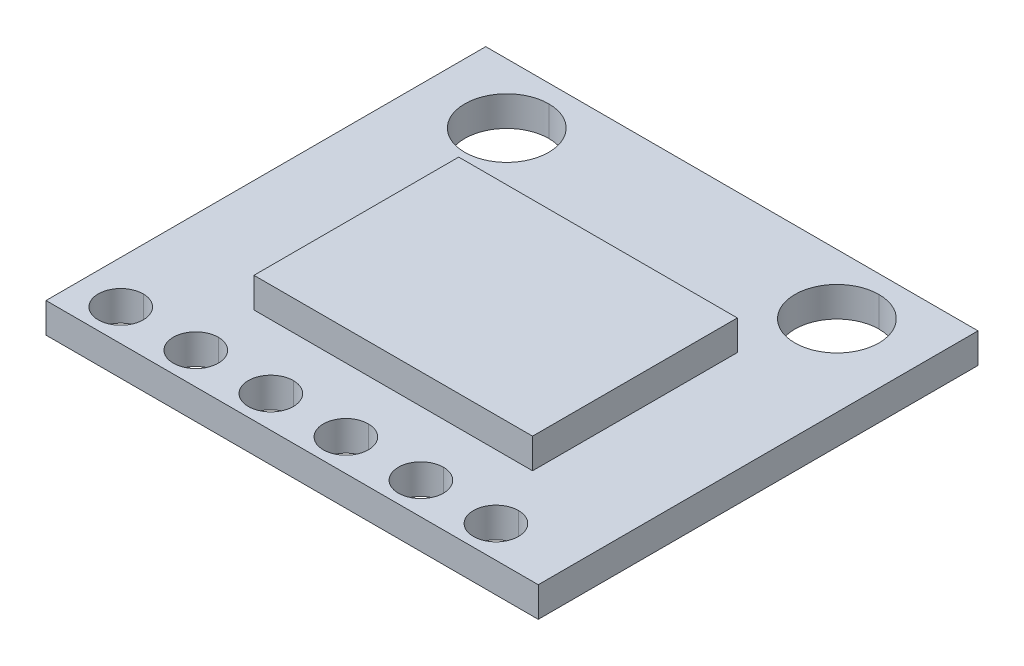
ISO-10303-21;
HEADER;
FILE_DESCRIPTION(('STEP AP214'),'2;1');
FILE_NAME('part.step','',(''),(''),'','','');
FILE_SCHEMA(('AUTOMOTIVE_DESIGN { 1 0 10303 214 1 1 1 1 }'));
ENDSEC;
DATA;
#1=APPLICATION_CONTEXT('core data for automotive mechanical design processes');
#2=APPLICATION_PROTOCOL_DEFINITION('international standard','automotive_design',2000,#1);
#3=PRODUCT_CONTEXT('',#1,'mechanical');
#4=PRODUCT('Part','Part','',(#3));
#5=PRODUCT_RELATED_PRODUCT_CATEGORY('part','',(#4));
#6=PRODUCT_DEFINITION_FORMATION('','',#4);
#7=PRODUCT_DEFINITION_CONTEXT('part definition',#1,'design');
#8=PRODUCT_DEFINITION('design','',#6,#7);
#9=PRODUCT_DEFINITION_SHAPE('','',#8);
#10=(LENGTH_UNIT() NAMED_UNIT(*) SI_UNIT(.MILLI.,.METRE.));
#11=(NAMED_UNIT(*) PLANE_ANGLE_UNIT() SI_UNIT($,.RADIAN.));
#12=(NAMED_UNIT(*) SI_UNIT($,.STERADIAN.) SOLID_ANGLE_UNIT());
#13=UNCERTAINTY_MEASURE_WITH_UNIT(LENGTH_MEASURE(1.E-05),#10,'distance_accuracy_value','');
#14=(GEOMETRIC_REPRESENTATION_CONTEXT(3) GLOBAL_UNCERTAINTY_ASSIGNED_CONTEXT((#13)) GLOBAL_UNIT_ASSIGNED_CONTEXT((#10,
#11,#12)) REPRESENTATION_CONTEXT('',''));
#15=CARTESIAN_POINT('',(0.,0.,0.));
#16=DIRECTION('',(0.,0.,1.));
#17=DIRECTION('',(1.,0.,0.));
#18=AXIS2_PLACEMENT_3D('',#15,#16,#17);
#19=CARTESIAN_POINT('',(0.,2.,0.));
#20=DIRECTION('',(0.,1.,0.));
#21=DIRECTION('',(1.,0.,0.));
#22=AXIS2_PLACEMENT_3D('',#19,#20,#21);
#23=PLANE('',#22);
#24=DIRECTION('',(0.,0.,1.));
#25=VECTOR('',#24,1.);
#26=CARTESIAN_POINT('',(3.736721990265,2.,-10.0131106195));
#27=LINE('',#26,#25);
#28=CARTESIAN_POINT('',(3.736721990265,2.,-10.0131106195));
#29=VERTEX_POINT('',#28);
#30=CARTESIAN_POINT('',(3.736721990265,2.,-3.191395934166));
#31=VERTEX_POINT('',#30);
#32=EDGE_CURVE('E225',#29,#31,#27,.T.);
#33=ORIENTED_EDGE('',*,*,#32,.T.);
#34=DIRECTION('',(1.,0.,0.));
#35=VECTOR('',#34,1.);
#36=CARTESIAN_POINT('',(3.736721990265,2.,-3.191395934166));
#37=LINE('',#36,#35);
#38=CARTESIAN_POINT('',(13.018311487782,2.,-3.191395934166));
#39=VERTEX_POINT('',#38);
#40=EDGE_CURVE('E215',#31,#39,#37,.T.);
#41=ORIENTED_EDGE('',*,*,#40,.T.);
#42=DIRECTION('',(0.,0.,-1.));
#43=VECTOR('',#42,1.);
#44=CARTESIAN_POINT('',(13.018311487782,2.,-10.0131106195));
#45=LINE('',#44,#43);
#46=CARTESIAN_POINT('',(13.018311487782,2.,-10.0131106195));
#47=VERTEX_POINT('',#46);
#48=EDGE_CURVE('E25',#39,#47,#45,.T.);
#49=ORIENTED_EDGE('',*,*,#48,.T.);
#50=DIRECTION('',(-1.,0.,0.));
#51=VECTOR('',#50,1.);
#52=CARTESIAN_POINT('',(3.736721990265,2.,-10.0131106195));
#53=LINE('',#52,#51);
#54=EDGE_CURVE('E10',#47,#29,#53,.T.);
#55=ORIENTED_EDGE('',*,*,#54,.T.);
#56=EDGE_LOOP('',(#33,#41,#49,#55));
#57=FACE_BOUND('',#56,.T.);
#58=ADVANCED_FACE('F15',(#57),#23,.T.);
#59=CARTESIAN_POINT('',(3.736721990265,2.,-10.0131106195));
#60=DIRECTION('',(0.,0.,1.));
#61=DIRECTION('',(1.,0.,0.));
#62=AXIS2_PLACEMENT_3D('',#59,#60,#61);
#63=PLANE('',#62);
#64=DIRECTION('',(-1.,0.,0.));
#65=VECTOR('',#64,1.);
#66=CARTESIAN_POINT('',(3.736721990265,1.,-10.0131106195));
#67=LINE('',#66,#65);
#68=CARTESIAN_POINT('',(13.018311487782,1.,-10.0131106195));
#69=VERTEX_POINT('',#68);
#70=CARTESIAN_POINT('',(3.736721990265,1.,-10.0131106195));
#71=VERTEX_POINT('',#70);
#72=EDGE_CURVE('E325',#69,#71,#67,.T.);
#73=ORIENTED_EDGE('',*,*,#72,.T.);
#74=DIRECTION('',(0.,-1.,0.));
#75=VECTOR('',#74,1.);
#76=CARTESIAN_POINT('',(3.736721990265,2.,-10.0131106195));
#77=LINE('',#76,#75);
#78=EDGE_CURVE('E216',#29,#71,#77,.T.);
#79=ORIENTED_EDGE('',*,*,#78,.F.);
#80=ORIENTED_EDGE('',*,*,#54,.F.);
#81=DIRECTION('',(0.,-1.,0.));
#82=VECTOR('',#81,1.);
#83=CARTESIAN_POINT('',(13.018311487782,2.,-10.0131106195));
#84=LINE('',#83,#82);
#85=EDGE_CURVE('E222',#47,#69,#84,.T.);
#86=ORIENTED_EDGE('',*,*,#85,.T.);
#87=EDGE_LOOP('',(#73,#79,#80,#86));
#88=FACE_BOUND('',#87,.T.);
#89=ADVANCED_FACE('F526',(#88),#63,.F.);
#90=CARTESIAN_POINT('',(13.018311487782,2.,-10.0131106195));
#91=DIRECTION('',(-1.,0.,0.));
#92=DIRECTION('',(0.,0.,1.));
#93=AXIS2_PLACEMENT_3D('',#90,#91,#92);
#94=PLANE('',#93);
#95=DIRECTION('',(0.,0.,-1.));
#96=VECTOR('',#95,1.);
#97=CARTESIAN_POINT('',(13.018311487782,1.,-10.0131106195));
#98=LINE('',#97,#96);
#99=CARTESIAN_POINT('',(13.018311487782,1.,-3.191395934166));
#100=VERTEX_POINT('',#99);
#101=EDGE_CURVE('E197',#100,#69,#98,.T.);
#102=ORIENTED_EDGE('',*,*,#101,.T.);
#103=ORIENTED_EDGE('',*,*,#85,.F.);
#104=ORIENTED_EDGE('',*,*,#48,.F.);
#105=DIRECTION('',(0.,-1.,0.));
#106=VECTOR('',#105,1.);
#107=CARTESIAN_POINT('',(13.018311487782,2.,-3.191395934166));
#108=LINE('',#107,#106);
#109=EDGE_CURVE('E213',#39,#100,#108,.T.);
#110=ORIENTED_EDGE('',*,*,#109,.T.);
#111=EDGE_LOOP('',(#102,#103,#104,#110));
#112=FACE_BOUND('',#111,.T.);
#113=ADVANCED_FACE('F524',(#112),#94,.F.);
#114=CARTESIAN_POINT('',(3.736721990265,2.,-3.191395934166));
#115=DIRECTION('',(0.,0.,-1.));
#116=DIRECTION('',(0.,-1.,0.));
#117=AXIS2_PLACEMENT_3D('',#114,#115,#116);
#118=PLANE('',#117);
#119=DIRECTION('',(1.,0.,0.));
#120=VECTOR('',#119,1.);
#121=CARTESIAN_POINT('',(3.736721990265,1.,-3.191395934166));
#122=LINE('',#121,#120);
#123=CARTESIAN_POINT('',(3.736721990265,1.,-3.191395934166));
#124=VERTEX_POINT('',#123);
#125=EDGE_CURVE('E188',#124,#100,#122,.T.);
#126=ORIENTED_EDGE('',*,*,#125,.T.);
#127=ORIENTED_EDGE('',*,*,#109,.F.);
#128=ORIENTED_EDGE('',*,*,#40,.F.);
#129=DIRECTION('',(0.,-1.,0.));
#130=VECTOR('',#129,1.);
#131=CARTESIAN_POINT('',(3.736721990265,2.,-3.191395934166));
#132=LINE('',#131,#130);
#133=EDGE_CURVE('E234',#31,#124,#132,.T.);
#134=ORIENTED_EDGE('',*,*,#133,.T.);
#135=EDGE_LOOP('',(#126,#127,#128,#134));
#136=FACE_BOUND('',#135,.T.);
#137=ADVANCED_FACE('F513',(#136),#118,.F.);
#138=CARTESIAN_POINT('',(3.736721990265,2.,-10.0131106195));
#139=DIRECTION('',(1.,0.,0.));
#140=DIRECTION('',(0.,1.,0.));
#141=AXIS2_PLACEMENT_3D('',#138,#139,#140);
#142=PLANE('',#141);
#143=DIRECTION('',(0.,0.,1.));
#144=VECTOR('',#143,1.);
#145=CARTESIAN_POINT('',(3.736721990265,1.,-10.0131106195));
#146=LINE('',#145,#144);
#147=EDGE_CURVE('E282',#71,#124,#146,.T.);
#148=ORIENTED_EDGE('',*,*,#147,.T.);
#149=ORIENTED_EDGE('',*,*,#133,.F.);
#150=ORIENTED_EDGE('',*,*,#32,.F.);
#151=ORIENTED_EDGE('',*,*,#78,.T.);
#152=EDGE_LOOP('',(#148,#149,#150,#151));
#153=FACE_BOUND('',#152,.T.);
#154=ADVANCED_FACE('F517',(#153),#142,.F.);
#155=CARTESIAN_POINT('',(3.929004382958,0.,-1.061195065883));
#156=DIRECTION('',(0.,1.,0.));
#157=DIRECTION('',(0.,0.,1.));
#158=AXIS2_PLACEMENT_3D('',#155,#156,#157);
#159=CYLINDRICAL_SURFACE('',#158,0.75);
#160=DIRECTION('',(0.,1.,0.));
#161=VECTOR('',#160,1.);
#162=CARTESIAN_POINT('',(3.929004382958,0.,-1.811195065883));
#163=LINE('',#162,#161);
#164=CARTESIAN_POINT('',(3.929004382958,0.,-1.811195065883));
#165=VERTEX_POINT('',#164);
#166=CARTESIAN_POINT('',(3.929004382958,1.,-1.811195065883));
#167=VERTEX_POINT('',#166);
#168=EDGE_CURVE('E208',#165,#167,#163,.T.);
#169=ORIENTED_EDGE('',*,*,#168,.F.);
#170=CARTESIAN_POINT('',(3.929004382958,0.,-1.061195065883));
#171=DIRECTION('',(0.,1.,0.));
#172=DIRECTION('',(0.,0.,1.));
#173=AXIS2_PLACEMENT_3D('',#170,#171,#172);
#174=CIRCLE('',#173,0.75);
#175=CARTESIAN_POINT('',(3.929004382958,0.,-0.311195065883));
#176=VERTEX_POINT('',#175);
#177=EDGE_CURVE('E169',#176,#165,#174,.T.);
#178=ORIENTED_EDGE('',*,*,#177,.F.);
#179=DIRECTION('',(0.,1.,0.));
#180=VECTOR('',#179,1.);
#181=CARTESIAN_POINT('',(3.929004382958,0.,-0.311195065883));
#182=LINE('',#181,#180);
#183=CARTESIAN_POINT('',(3.929004382958,1.,-0.311195065883));
#184=VERTEX_POINT('',#183);
#185=EDGE_CURVE('E295',#176,#184,#182,.T.);
#186=ORIENTED_EDGE('',*,*,#185,.T.);
#187=CARTESIAN_POINT('',(3.929004382958,1.,-1.061195065883));
#188=DIRECTION('',(0.,1.,0.));
#189=DIRECTION('',(0.,0.,1.));
#190=AXIS2_PLACEMENT_3D('',#187,#188,#189);
#191=CIRCLE('',#190,0.75);
#192=EDGE_CURVE('E256',#184,#167,#191,.T.);
#193=ORIENTED_EDGE('',*,*,#192,.T.);
#194=EDGE_LOOP('',(#169,#178,#186,#193));
#195=FACE_BOUND('',#194,.T.);
#196=ADVANCED_FACE('F539',(#195),#159,.F.);
#197=CARTESIAN_POINT('',(6.429004382958,0.,-1.061195065883));
#198=DIRECTION('',(0.,1.,0.));
#199=DIRECTION('',(0.,0.,1.));
#200=AXIS2_PLACEMENT_3D('',#197,#198,#199);
#201=CYLINDRICAL_SURFACE('',#200,0.75);
#202=DIRECTION('',(0.,1.,0.));
#203=VECTOR('',#202,1.);
#204=CARTESIAN_POINT('',(6.429004382958,0.,-1.811195065883));
#205=LINE('',#204,#203);
#206=CARTESIAN_POINT('',(6.429004382958,0.,-1.811195065883));
#207=VERTEX_POINT('',#206);
#208=CARTESIAN_POINT('',(6.429004382958,1.,-1.811195065883));
#209=VERTEX_POINT('',#208);
#210=EDGE_CURVE('E294',#207,#209,#205,.T.);
#211=ORIENTED_EDGE('',*,*,#210,.F.);
#212=CARTESIAN_POINT('',(6.429004382958,0.,-1.061195065883));
#213=DIRECTION('',(0.,1.,0.));
#214=DIRECTION('',(0.,0.,1.));
#215=AXIS2_PLACEMENT_3D('',#212,#213,#214);
#216=CIRCLE('',#215,0.75);
#217=CARTESIAN_POINT('',(6.429004382958,0.,-0.311195065883));
#218=VERTEX_POINT('',#217);
#219=EDGE_CURVE('E354',#218,#207,#216,.T.);
#220=ORIENTED_EDGE('',*,*,#219,.F.);
#221=DIRECTION('',(0.,1.,0.));
#222=VECTOR('',#221,1.);
#223=CARTESIAN_POINT('',(6.429004382958,0.,-0.311195065883));
#224=LINE('',#223,#222);
#225=CARTESIAN_POINT('',(6.429004382958,1.,-0.311195065883));
#226=VERTEX_POINT('',#225);
#227=EDGE_CURVE('E300',#218,#226,#224,.T.);
#228=ORIENTED_EDGE('',*,*,#227,.T.);
#229=CARTESIAN_POINT('',(6.429004382958,1.,-1.061195065883));
#230=DIRECTION('',(0.,1.,0.));
#231=DIRECTION('',(0.,0.,1.));
#232=AXIS2_PLACEMENT_3D('',#229,#230,#231);
#233=CIRCLE('',#232,0.75);
#234=EDGE_CURVE('E253',#226,#209,#233,.T.);
#235=ORIENTED_EDGE('',*,*,#234,.T.);
#236=EDGE_LOOP('',(#211,#220,#228,#235));
#237=FACE_BOUND('',#236,.T.);
#238=ADVANCED_FACE('F536',(#237),#201,.F.);
#239=CARTESIAN_POINT('',(8.929004382958,0.,-1.061195065883));
#240=DIRECTION('',(0.,1.,0.));
#241=DIRECTION('',(0.,0.,1.));
#242=AXIS2_PLACEMENT_3D('',#239,#240,#241);
#243=CYLINDRICAL_SURFACE('',#242,0.75);
#244=DIRECTION('',(0.,1.,0.));
#245=VECTOR('',#244,1.);
#246=CARTESIAN_POINT('',(8.929004382958,0.,-1.811195065883));
#247=LINE('',#246,#245);
#248=CARTESIAN_POINT('',(8.929004382958,0.,-1.811195065883));
#249=VERTEX_POINT('',#248);
#250=CARTESIAN_POINT('',(8.929004382958,1.,-1.811195065883));
#251=VERTEX_POINT('',#250);
#252=EDGE_CURVE('E343',#249,#251,#247,.T.);
#253=ORIENTED_EDGE('',*,*,#252,.F.);
#254=CARTESIAN_POINT('',(8.929004382958,0.,-1.061195065883));
#255=DIRECTION('',(0.,1.,0.));
#256=DIRECTION('',(0.,0.,1.));
#257=AXIS2_PLACEMENT_3D('',#254,#255,#256);
#258=CIRCLE('',#257,0.75);
#259=CARTESIAN_POINT('',(8.929004382958,0.,-0.311195065883));
#260=VERTEX_POINT('',#259);
#261=EDGE_CURVE('E377',#260,#249,#258,.T.);
#262=ORIENTED_EDGE('',*,*,#261,.F.);
#263=DIRECTION('',(0.,1.,0.));
#264=VECTOR('',#263,1.);
#265=CARTESIAN_POINT('',(8.929004382958,0.,-0.311195065883));
#266=LINE('',#265,#264);
#267=CARTESIAN_POINT('',(8.929004382958,1.,-0.311195065883));
#268=VERTEX_POINT('',#267);
#269=EDGE_CURVE('E289',#260,#268,#266,.T.);
#270=ORIENTED_EDGE('',*,*,#269,.T.);
#271=CARTESIAN_POINT('',(8.929004382958,1.,-1.061195065883));
#272=DIRECTION('',(0.,1.,0.));
#273=DIRECTION('',(0.,0.,1.));
#274=AXIS2_PLACEMENT_3D('',#271,#272,#273);
#275=CIRCLE('',#274,0.75);
#276=EDGE_CURVE('E257',#268,#251,#275,.T.);
#277=ORIENTED_EDGE('',*,*,#276,.T.);
#278=EDGE_LOOP('',(#253,#262,#270,#277));
#279=FACE_BOUND('',#278,.T.);
#280=ADVANCED_FACE('F553',(#279),#243,.F.);
#281=CARTESIAN_POINT('',(11.429004382958,0.,-1.061195065883));
#282=DIRECTION('',(0.,1.,0.));
#283=DIRECTION('',(0.,0.,1.));
#284=AXIS2_PLACEMENT_3D('',#281,#282,#283);
#285=CYLINDRICAL_SURFACE('',#284,0.75);
#286=DIRECTION('',(0.,1.,0.));
#287=VECTOR('',#286,1.);
#288=CARTESIAN_POINT('',(11.429004382958,0.,-1.811195065883));
#289=LINE('',#288,#287);
#290=CARTESIAN_POINT('',(11.429004382958,0.,-1.811195065883));
#291=VERTEX_POINT('',#290);
#292=CARTESIAN_POINT('',(11.429004382958,1.,-1.811195065883));
#293=VERTEX_POINT('',#292);
#294=EDGE_CURVE('E203',#291,#293,#289,.T.);
#295=ORIENTED_EDGE('',*,*,#294,.F.);
#296=CARTESIAN_POINT('',(11.429004382958,0.,-1.061195065883));
#297=DIRECTION('',(0.,1.,0.));
#298=DIRECTION('',(0.,0.,1.));
#299=AXIS2_PLACEMENT_3D('',#296,#297,#298);
#300=CIRCLE('',#299,0.75);
#301=CARTESIAN_POINT('',(11.429004382958,0.,-0.311195065883));
#302=VERTEX_POINT('',#301);
#303=EDGE_CURVE('E373',#302,#291,#300,.T.);
#304=ORIENTED_EDGE('',*,*,#303,.F.);
#305=DIRECTION('',(0.,1.,0.));
#306=VECTOR('',#305,1.);
#307=CARTESIAN_POINT('',(11.429004382958,0.,-0.311195065883));
#308=LINE('',#307,#306);
#309=CARTESIAN_POINT('',(11.429004382958,1.,-0.311195065883));
#310=VERTEX_POINT('',#309);
#311=EDGE_CURVE('E261',#302,#310,#308,.T.);
#312=ORIENTED_EDGE('',*,*,#311,.T.);
#313=CARTESIAN_POINT('',(11.429004382958,1.,-1.061195065883));
#314=DIRECTION('',(0.,1.,0.));
#315=DIRECTION('',(0.,0.,1.));
#316=AXIS2_PLACEMENT_3D('',#313,#314,#315);
#317=CIRCLE('',#316,0.75);
#318=EDGE_CURVE('E275',#310,#293,#317,.T.);
#319=ORIENTED_EDGE('',*,*,#318,.T.);
#320=EDGE_LOOP('',(#295,#304,#312,#319));
#321=FACE_BOUND('',#320,.T.);
#322=ADVANCED_FACE('F556',(#321),#285,.F.);
#323=CARTESIAN_POINT('',(13.7,0.,-12.65));
#324=DIRECTION('',(0.,1.,0.));
#325=DIRECTION('',(0.,0.,1.));
#326=AXIS2_PLACEMENT_3D('',#323,#324,#325);
#327=CYLINDRICAL_SURFACE('',#326,1.4);
#328=DIRECTION('',(0.,1.,0.));
#329=VECTOR('',#328,1.);
#330=CARTESIAN_POINT('',(13.7,0.,-14.05));
#331=LINE('',#330,#329);
#332=CARTESIAN_POINT('',(13.7,0.,-14.05));
#333=VERTEX_POINT('',#332);
#334=CARTESIAN_POINT('',(13.7,1.,-14.05));
#335=VERTEX_POINT('',#334);
#336=EDGE_CURVE('E19',#333,#335,#331,.T.);
#337=ORIENTED_EDGE('',*,*,#336,.F.);
#338=CARTESIAN_POINT('',(13.7,0.,-12.65));
#339=DIRECTION('',(0.,1.,0.));
#340=DIRECTION('',(0.,0.,1.));
#341=AXIS2_PLACEMENT_3D('',#338,#339,#340);
#342=CIRCLE('',#341,1.4);
#343=CARTESIAN_POINT('',(13.7,0.,-11.25));
#344=VERTEX_POINT('',#343);
#345=EDGE_CURVE('E369',#344,#333,#342,.T.);
#346=ORIENTED_EDGE('',*,*,#345,.F.);
#347=DIRECTION('',(0.,1.,0.));
#348=VECTOR('',#347,1.);
#349=CARTESIAN_POINT('',(13.7,0.,-11.25));
#350=LINE('',#349,#348);
#351=CARTESIAN_POINT('',(13.7,1.,-11.25));
#352=VERTEX_POINT('',#351);
#353=EDGE_CURVE('E251',#344,#352,#350,.T.);
#354=ORIENTED_EDGE('',*,*,#353,.T.);
#355=CARTESIAN_POINT('',(13.7,1.,-12.65));
#356=DIRECTION('',(0.,1.,0.));
#357=DIRECTION('',(0.,0.,1.));
#358=AXIS2_PLACEMENT_3D('',#355,#356,#357);
#359=CIRCLE('',#358,1.4);
#360=EDGE_CURVE('E279',#352,#335,#359,.T.);
#361=ORIENTED_EDGE('',*,*,#360,.T.);
#362=EDGE_LOOP('',(#337,#346,#354,#361));
#363=FACE_BOUND('',#362,.T.);
#364=ADVANCED_FACE('F561',(#363),#327,.F.);
#365=CARTESIAN_POINT('',(2.7,0.,-12.65));
#366=DIRECTION('',(0.,1.,0.));
#367=DIRECTION('',(0.,0.,1.));
#368=AXIS2_PLACEMENT_3D('',#365,#366,#367);
#369=CYLINDRICAL_SURFACE('',#368,1.4);
#370=DIRECTION('',(0.,1.,0.));
#371=VECTOR('',#370,1.);
#372=CARTESIAN_POINT('',(2.7,0.,-14.05));
#373=LINE('',#372,#371);
#374=CARTESIAN_POINT('',(2.7,0.,-14.05));
#375=VERTEX_POINT('',#374);
#376=CARTESIAN_POINT('',(2.7,1.,-14.05));
#377=VERTEX_POINT('',#376);
#378=EDGE_CURVE('E201',#375,#377,#373,.T.);
#379=ORIENTED_EDGE('',*,*,#378,.F.);
#380=CARTESIAN_POINT('',(2.7,0.,-12.65));
#381=DIRECTION('',(0.,1.,0.));
#382=DIRECTION('',(0.,0.,1.));
#383=AXIS2_PLACEMENT_3D('',#380,#381,#382);
#384=CIRCLE('',#383,1.4);
#385=CARTESIAN_POINT('',(2.7,0.,-11.25));
#386=VERTEX_POINT('',#385);
#387=EDGE_CURVE('E340',#386,#375,#384,.T.);
#388=ORIENTED_EDGE('',*,*,#387,.F.);
#389=DIRECTION('',(0.,1.,0.));
#390=VECTOR('',#389,1.);
#391=CARTESIAN_POINT('',(2.7,0.,-11.25));
#392=LINE('',#391,#390);
#393=CARTESIAN_POINT('',(2.7,1.,-11.25));
#394=VERTEX_POINT('',#393);
#395=EDGE_CURVE('E316',#386,#394,#392,.T.);
#396=ORIENTED_EDGE('',*,*,#395,.T.);
#397=CARTESIAN_POINT('',(2.7,1.,-12.65));
#398=DIRECTION('',(0.,1.,0.));
#399=DIRECTION('',(0.,0.,1.));
#400=AXIS2_PLACEMENT_3D('',#397,#398,#399);
#401=CIRCLE('',#400,1.4);
#402=EDGE_CURVE('E309',#394,#377,#401,.T.);
#403=ORIENTED_EDGE('',*,*,#402,.T.);
#404=EDGE_LOOP('',(#379,#388,#396,#403));
#405=FACE_BOUND('',#404,.T.);
#406=ADVANCED_FACE('F446',(#405),#369,.F.);
#407=CARTESIAN_POINT('',(13.929004382958,0.,-1.061195065883));
#408=DIRECTION('',(0.,1.,0.));
#409=DIRECTION('',(0.,0.,1.));
#410=AXIS2_PLACEMENT_3D('',#407,#408,#409);
#411=CYLINDRICAL_SURFACE('',#410,0.75);
#412=DIRECTION('',(0.,1.,0.));
#413=VECTOR('',#412,1.);
#414=CARTESIAN_POINT('',(13.929004382958,0.,-1.811195065883));
#415=LINE('',#414,#413);
#416=CARTESIAN_POINT('',(13.929004382958,0.,-1.811195065883));
#417=VERTEX_POINT('',#416);
#418=CARTESIAN_POINT('',(13.929004382958,1.,-1.811195065883));
#419=VERTEX_POINT('',#418);
#420=EDGE_CURVE('E242',#417,#419,#415,.T.);
#421=ORIENTED_EDGE('',*,*,#420,.F.);
#422=CARTESIAN_POINT('',(13.929004382958,0.,-1.061195065883));
#423=DIRECTION('',(0.,1.,0.));
#424=DIRECTION('',(0.,0.,1.));
#425=AXIS2_PLACEMENT_3D('',#422,#423,#424);
#426=CIRCLE('',#425,0.75);
#427=CARTESIAN_POINT('',(13.929004382958,0.,-0.311195065883));
#428=VERTEX_POINT('',#427);
#429=EDGE_CURVE('E299',#428,#417,#426,.T.);
#430=ORIENTED_EDGE('',*,*,#429,.F.);
#431=DIRECTION('',(0.,1.,0.));
#432=VECTOR('',#431,1.);
#433=CARTESIAN_POINT('',(13.929004382958,0.,-0.311195065883));
#434=LINE('',#433,#432);
#435=CARTESIAN_POINT('',(13.929004382958,1.,-0.311195065883));
#436=VERTEX_POINT('',#435);
#437=EDGE_CURVE('E262',#428,#436,#434,.T.);
#438=ORIENTED_EDGE('',*,*,#437,.T.);
#439=CARTESIAN_POINT('',(13.929004382958,1.,-1.061195065883));
#440=DIRECTION('',(0.,1.,0.));
#441=DIRECTION('',(0.,0.,1.));
#442=AXIS2_PLACEMENT_3D('',#439,#440,#441);
#443=CIRCLE('',#442,0.75);
#444=EDGE_CURVE('E274',#436,#419,#443,.T.);
#445=ORIENTED_EDGE('',*,*,#444,.T.);
#446=EDGE_LOOP('',(#421,#430,#438,#445));
#447=FACE_BOUND('',#446,.T.);
#448=ADVANCED_FACE('F546',(#447),#411,.F.);
#449=CARTESIAN_POINT('',(1.429004382958,0.,-1.061195065883));
#450=DIRECTION('',(0.,1.,0.));
#451=DIRECTION('',(0.,0.,1.));
#452=AXIS2_PLACEMENT_3D('',#449,#450,#451);
#453=CYLINDRICAL_SURFACE('',#452,0.75);
#454=DIRECTION('',(0.,1.,0.));
#455=VECTOR('',#454,1.);
#456=CARTESIAN_POINT('',(1.429004382958,0.,-1.811195065883));
#457=LINE('',#456,#455);
#458=CARTESIAN_POINT('',(1.429004382958,0.,-1.811195065883));
#459=VERTEX_POINT('',#458);
#460=CARTESIAN_POINT('',(1.429004382958,1.,-1.811195065883));
#461=VERTEX_POINT('',#460);
#462=EDGE_CURVE('E270',#459,#461,#457,.T.);
#463=ORIENTED_EDGE('',*,*,#462,.F.);
#464=CARTESIAN_POINT('',(1.429004382958,0.,-1.061195065883));
#465=DIRECTION('',(0.,1.,0.));
#466=DIRECTION('',(0.,0.,1.));
#467=AXIS2_PLACEMENT_3D('',#464,#465,#466);
#468=CIRCLE('',#467,0.75);
#469=CARTESIAN_POINT('',(1.429004382958,0.,-0.311195065883));
#470=VERTEX_POINT('',#469);
#471=EDGE_CURVE('E296',#470,#459,#468,.T.);
#472=ORIENTED_EDGE('',*,*,#471,.F.);
#473=DIRECTION('',(0.,1.,0.));
#474=VECTOR('',#473,1.);
#475=CARTESIAN_POINT('',(1.429004382958,0.,-0.311195065883));
#476=LINE('',#475,#474);
#477=CARTESIAN_POINT('',(1.429004382958,1.,-0.311195065883));
#478=VERTEX_POINT('',#477);
#479=EDGE_CURVE('E322',#470,#478,#476,.T.);
#480=ORIENTED_EDGE('',*,*,#479,.T.);
#481=CARTESIAN_POINT('',(1.429004382958,1.,-1.061195065883));
#482=DIRECTION('',(0.,1.,0.));
#483=DIRECTION('',(0.,0.,1.));
#484=AXIS2_PLACEMENT_3D('',#481,#482,#483);
#485=CIRCLE('',#484,0.75);
#486=EDGE_CURVE('E271',#478,#461,#485,.T.);
#487=ORIENTED_EDGE('',*,*,#486,.T.);
#488=EDGE_LOOP('',(#463,#472,#480,#487));
#489=FACE_BOUND('',#488,.T.);
#490=ADVANCED_FACE('F543',(#489),#453,.F.);
#491=CARTESIAN_POINT('',(0.,0.,0.));
#492=DIRECTION('',(0.,-1.,0.));
#493=DIRECTION('',(0.,0.,-1.));
#494=AXIS2_PLACEMENT_3D('',#491,#492,#493);
#495=PLANE('',#494);
#496=DIRECTION('',(0.,0.,1.));
#497=VECTOR('',#496,1.);
#498=CARTESIAN_POINT('',(0.,0.,0.));
#499=LINE('',#498,#497);
#500=CARTESIAN_POINT('',(0.,0.,-14.65));
#501=VERTEX_POINT('',#500);
#502=CARTESIAN_POINT('',(0.,0.,0.));
#503=VERTEX_POINT('',#502);
#504=EDGE_CURVE('E176',#501,#503,#499,.T.);
#505=ORIENTED_EDGE('',*,*,#504,.F.);
#506=DIRECTION('',(-1.,0.,0.));
#507=VECTOR('',#506,1.);
#508=CARTESIAN_POINT('',(0.,0.,-14.65));
#509=LINE('',#508,#507);
#510=CARTESIAN_POINT('',(16.4,0.,-14.65));
#511=VERTEX_POINT('',#510);
#512=EDGE_CURVE('E158',#511,#501,#509,.T.);
#513=ORIENTED_EDGE('',*,*,#512,.F.);
#514=DIRECTION('',(0.,0.,-1.));
#515=VECTOR('',#514,1.);
#516=CARTESIAN_POINT('',(16.4,0.,0.));
#517=LINE('',#516,#515);
#518=CARTESIAN_POINT('',(16.4,0.,0.));
#519=VERTEX_POINT('',#518);
#520=EDGE_CURVE('E335',#519,#511,#517,.T.);
#521=ORIENTED_EDGE('',*,*,#520,.F.);
#522=DIRECTION('',(1.,0.,0.));
#523=VECTOR('',#522,1.);
#524=CARTESIAN_POINT('',(0.,0.,0.));
#525=LINE('',#524,#523);
#526=EDGE_CURVE('E180',#503,#519,#525,.T.);
#527=ORIENTED_EDGE('',*,*,#526,.F.);
#528=EDGE_LOOP('',(#505,#513,#521,#527));
#529=FACE_BOUND('',#528,.T.);
#530=ORIENTED_EDGE('',*,*,#471,.T.);
#531=CARTESIAN_POINT('',(1.429004382958,0.,-1.061195065883));
#532=DIRECTION('',(0.,1.,0.));
#533=DIRECTION('',(0.,0.,1.));
#534=AXIS2_PLACEMENT_3D('',#531,#532,#533);
#535=CIRCLE('',#534,0.75);
#536=EDGE_CURVE('E266',#459,#470,#535,.T.);
#537=ORIENTED_EDGE('',*,*,#536,.T.);
#538=EDGE_LOOP('',(#530,#537));
#539=FACE_BOUND('',#538,.T.);
#540=ORIENTED_EDGE('',*,*,#429,.T.);
#541=CARTESIAN_POINT('',(13.929004382958,0.,-1.061195065883));
#542=DIRECTION('',(0.,1.,0.));
#543=DIRECTION('',(0.,0.,1.));
#544=AXIS2_PLACEMENT_3D('',#541,#542,#543);
#545=CIRCLE('',#544,0.75);
#546=EDGE_CURVE('E246',#417,#428,#545,.T.);
#547=ORIENTED_EDGE('',*,*,#546,.T.);
#548=EDGE_LOOP('',(#540,#547));
#549=FACE_BOUND('',#548,.T.);
#550=ORIENTED_EDGE('',*,*,#387,.T.);
#551=CARTESIAN_POINT('',(2.7,0.,-12.65));
#552=DIRECTION('',(0.,1.,0.));
#553=DIRECTION('',(0.,0.,1.));
#554=AXIS2_PLACEMENT_3D('',#551,#552,#553);
#555=CIRCLE('',#554,1.4);
#556=EDGE_CURVE('E364',#375,#386,#555,.T.);
#557=ORIENTED_EDGE('',*,*,#556,.T.);
#558=EDGE_LOOP('',(#550,#557));
#559=FACE_BOUND('',#558,.T.);
#560=ORIENTED_EDGE('',*,*,#345,.T.);
#561=CARTESIAN_POINT('',(13.7,0.,-12.65));
#562=DIRECTION('',(0.,1.,0.));
#563=DIRECTION('',(0.,0.,1.));
#564=AXIS2_PLACEMENT_3D('',#561,#562,#563);
#565=CIRCLE('',#564,1.4);
#566=EDGE_CURVE('E388',#333,#344,#565,.T.);
#567=ORIENTED_EDGE('',*,*,#566,.T.);
#568=EDGE_LOOP('',(#560,#567));
#569=FACE_BOUND('',#568,.T.);
#570=ORIENTED_EDGE('',*,*,#303,.T.);
#571=CARTESIAN_POINT('',(11.429004382958,0.,-1.061195065883));
#572=DIRECTION('',(0.,1.,0.));
#573=DIRECTION('',(0.,0.,1.));
#574=AXIS2_PLACEMENT_3D('',#571,#572,#573);
#575=CIRCLE('',#574,0.75);
#576=EDGE_CURVE('E207',#291,#302,#575,.T.);
#577=ORIENTED_EDGE('',*,*,#576,.T.);
#578=EDGE_LOOP('',(#570,#577));
#579=FACE_BOUND('',#578,.T.);
#580=ORIENTED_EDGE('',*,*,#261,.T.);
#581=CARTESIAN_POINT('',(8.929004382958,0.,-1.061195065883));
#582=DIRECTION('',(0.,1.,0.));
#583=DIRECTION('',(0.,0.,1.));
#584=AXIS2_PLACEMENT_3D('',#581,#582,#583);
#585=CIRCLE('',#584,0.75);
#586=EDGE_CURVE('E303',#249,#260,#585,.T.);
#587=ORIENTED_EDGE('',*,*,#586,.T.);
#588=EDGE_LOOP('',(#580,#587));
#589=FACE_BOUND('',#588,.T.);
#590=ORIENTED_EDGE('',*,*,#219,.T.);
#591=CARTESIAN_POINT('',(6.429004382958,0.,-1.061195065883));
#592=DIRECTION('',(0.,1.,0.));
#593=DIRECTION('',(0.,0.,1.));
#594=AXIS2_PLACEMENT_3D('',#591,#592,#593);
#595=CIRCLE('',#594,0.75);
#596=EDGE_CURVE('E290',#207,#218,#595,.T.);
#597=ORIENTED_EDGE('',*,*,#596,.T.);
#598=EDGE_LOOP('',(#590,#597));
#599=FACE_BOUND('',#598,.T.);
#600=ORIENTED_EDGE('',*,*,#177,.T.);
#601=CARTESIAN_POINT('',(3.929004382958,0.,-1.061195065883));
#602=DIRECTION('',(0.,1.,0.));
#603=DIRECTION('',(0.,0.,1.));
#604=AXIS2_PLACEMENT_3D('',#601,#602,#603);
#605=CIRCLE('',#604,0.75);
#606=EDGE_CURVE('E212',#165,#176,#605,.T.);
#607=ORIENTED_EDGE('',*,*,#606,.T.);
#608=EDGE_LOOP('',(#600,#607));
#609=FACE_BOUND('',#608,.T.);
#610=ADVANCED_FACE('F183',(#529,#539,#549,#559,#569,#579,#589,#599,#609),#495,.T.);
#611=CARTESIAN_POINT('',(0.,1.,-14.65));
#612=DIRECTION('',(0.,0.,1.));
#613=DIRECTION('',(1.,0.,0.));
#614=AXIS2_PLACEMENT_3D('',#611,#612,#613);
#615=PLANE('',#614);
#616=ORIENTED_EDGE('',*,*,#512,.T.);
#617=DIRECTION('',(0.,-1.,0.));
#618=VECTOR('',#617,1.);
#619=CARTESIAN_POINT('',(0.,1.,-14.65));
#620=LINE('',#619,#618);
#621=CARTESIAN_POINT('',(0.,1.,-14.65));
#622=VERTEX_POINT('',#621);
#623=EDGE_CURVE('E162',#622,#501,#620,.T.);
#624=ORIENTED_EDGE('',*,*,#623,.F.);
#625=DIRECTION('',(-1.,0.,0.));
#626=VECTOR('',#625,1.);
#627=CARTESIAN_POINT('',(0.,1.,-14.65));
#628=LINE('',#627,#626);
#629=CARTESIAN_POINT('',(16.4,1.,-14.65));
#630=VERTEX_POINT('',#629);
#631=EDGE_CURVE('E240',#630,#622,#628,.T.);
#632=ORIENTED_EDGE('',*,*,#631,.F.);
#633=DIRECTION('',(0.,-1.,0.));
#634=VECTOR('',#633,1.);
#635=CARTESIAN_POINT('',(16.4,1.,-14.65));
#636=LINE('',#635,#634);
#637=EDGE_CURVE('E164',#630,#511,#636,.T.);
#638=ORIENTED_EDGE('',*,*,#637,.T.);
#639=EDGE_LOOP('',(#616,#624,#632,#638));
#640=FACE_BOUND('',#639,.T.);
#641=ADVANCED_FACE('F160',(#640),#615,.F.);
#642=CARTESIAN_POINT('',(16.4,1.,0.));
#643=DIRECTION('',(-1.,0.,0.));
#644=DIRECTION('',(0.,0.,1.));
#645=AXIS2_PLACEMENT_3D('',#642,#643,#644);
#646=PLANE('',#645);
#647=ORIENTED_EDGE('',*,*,#520,.T.);
#648=ORIENTED_EDGE('',*,*,#637,.F.);
#649=DIRECTION('',(0.,0.,-1.));
#650=VECTOR('',#649,1.);
#651=CARTESIAN_POINT('',(16.4,1.,0.));
#652=LINE('',#651,#650);
#653=CARTESIAN_POINT('',(16.4,1.,0.));
#654=VERTEX_POINT('',#653);
#655=EDGE_CURVE('E237',#654,#630,#652,.T.);
#656=ORIENTED_EDGE('',*,*,#655,.F.);
#657=DIRECTION('',(0.,-1.,0.));
#658=VECTOR('',#657,1.);
#659=CARTESIAN_POINT('',(16.4,1.,0.));
#660=LINE('',#659,#658);
#661=EDGE_CURVE('E331',#654,#519,#660,.T.);
#662=ORIENTED_EDGE('',*,*,#661,.T.);
#663=EDGE_LOOP('',(#647,#648,#656,#662));
#664=FACE_BOUND('',#663,.T.);
#665=ADVANCED_FACE('F570',(#664),#646,.F.);
#666=CARTESIAN_POINT('',(0.,1.,0.));
#667=DIRECTION('',(0.,0.,-1.));
#668=DIRECTION('',(0.,-1.,0.));
#669=AXIS2_PLACEMENT_3D('',#666,#667,#668);
#670=PLANE('',#669);
#671=ORIENTED_EDGE('',*,*,#526,.T.);
#672=ORIENTED_EDGE('',*,*,#661,.F.);
#673=DIRECTION('',(1.,0.,0.));
#674=VECTOR('',#673,1.);
#675=CARTESIAN_POINT('',(0.,1.,0.));
#676=LINE('',#675,#674);
#677=CARTESIAN_POINT('',(0.,1.,0.));
#678=VERTEX_POINT('',#677);
#679=EDGE_CURVE('E241',#678,#654,#676,.T.);
#680=ORIENTED_EDGE('',*,*,#679,.F.);
#681=DIRECTION('',(0.,-1.,0.));
#682=VECTOR('',#681,1.);
#683=CARTESIAN_POINT('',(0.,1.,0.));
#684=LINE('',#683,#682);
#685=EDGE_CURVE('E181',#678,#503,#684,.T.);
#686=ORIENTED_EDGE('',*,*,#685,.T.);
#687=EDGE_LOOP('',(#671,#672,#680,#686));
#688=FACE_BOUND('',#687,.T.);
#689=ADVANCED_FACE('F560',(#688),#670,.F.);
#690=CARTESIAN_POINT('',(0.,1.,0.));
#691=DIRECTION('',(1.,0.,0.));
#692=DIRECTION('',(0.,1.,0.));
#693=AXIS2_PLACEMENT_3D('',#690,#691,#692);
#694=PLANE('',#693);
#695=ORIENTED_EDGE('',*,*,#504,.T.);
#696=ORIENTED_EDGE('',*,*,#685,.F.);
#697=DIRECTION('',(0.,0.,1.));
#698=VECTOR('',#697,1.);
#699=CARTESIAN_POINT('',(0.,1.,0.));
#700=LINE('',#699,#698);
#701=EDGE_CURVE('E178',#622,#678,#700,.T.);
#702=ORIENTED_EDGE('',*,*,#701,.F.);
#703=ORIENTED_EDGE('',*,*,#623,.T.);
#704=EDGE_LOOP('',(#695,#696,#702,#703));
#705=FACE_BOUND('',#704,.T.);
#706=ADVANCED_FACE('F174',(#705),#694,.F.);
#707=CARTESIAN_POINT('',(0.,1.,0.));
#708=DIRECTION('',(0.,-1.,0.));
#709=DIRECTION('',(0.,0.,-1.));
#710=AXIS2_PLACEMENT_3D('',#707,#708,#709);
#711=PLANE('',#710);
#712=ORIENTED_EDGE('',*,*,#147,.F.);
#713=ORIENTED_EDGE('',*,*,#72,.F.);
#714=ORIENTED_EDGE('',*,*,#101,.F.);
#715=ORIENTED_EDGE('',*,*,#125,.F.);
#716=EDGE_LOOP('',(#712,#713,#714,#715));
#717=FACE_BOUND('',#716,.T.);
#718=ORIENTED_EDGE('',*,*,#192,.F.);
#719=CARTESIAN_POINT('',(3.929004382958,1.,-1.061195065883));
#720=DIRECTION('',(0.,1.,0.));
#721=DIRECTION('',(0.,0.,1.));
#722=AXIS2_PLACEMENT_3D('',#719,#720,#721);
#723=CIRCLE('',#722,0.75);
#724=EDGE_CURVE('E211',#167,#184,#723,.T.);
#725=ORIENTED_EDGE('',*,*,#724,.F.);
#726=EDGE_LOOP('',(#718,#725));
#727=FACE_BOUND('',#726,.T.);
#728=ORIENTED_EDGE('',*,*,#234,.F.);
#729=CARTESIAN_POINT('',(6.429004382958,1.,-1.061195065883));
#730=DIRECTION('',(0.,1.,0.));
#731=DIRECTION('',(0.,0.,1.));
#732=AXIS2_PLACEMENT_3D('',#729,#730,#731);
#733=CIRCLE('',#732,0.75);
#734=EDGE_CURVE('E304',#209,#226,#733,.T.);
#735=ORIENTED_EDGE('',*,*,#734,.F.);
#736=EDGE_LOOP('',(#728,#735));
#737=FACE_BOUND('',#736,.T.);
#738=ORIENTED_EDGE('',*,*,#276,.F.);
#739=CARTESIAN_POINT('',(8.929004382958,1.,-1.061195065883));
#740=DIRECTION('',(0.,1.,0.));
#741=DIRECTION('',(0.,0.,1.));
#742=AXIS2_PLACEMENT_3D('',#739,#740,#741);
#743=CIRCLE('',#742,0.75);
#744=EDGE_CURVE('E347',#251,#268,#743,.T.);
#745=ORIENTED_EDGE('',*,*,#744,.F.);
#746=EDGE_LOOP('',(#738,#745));
#747=FACE_BOUND('',#746,.T.);
#748=ORIENTED_EDGE('',*,*,#318,.F.);
#749=CARTESIAN_POINT('',(11.429004382958,1.,-1.061195065883));
#750=DIRECTION('',(0.,1.,0.));
#751=DIRECTION('',(0.,0.,1.));
#752=AXIS2_PLACEMENT_3D('',#749,#750,#751);
#753=CIRCLE('',#752,0.75);
#754=EDGE_CURVE('E206',#293,#310,#753,.T.);
#755=ORIENTED_EDGE('',*,*,#754,.F.);
#756=EDGE_LOOP('',(#748,#755));
#757=FACE_BOUND('',#756,.T.);
#758=ORIENTED_EDGE('',*,*,#360,.F.);
#759=CARTESIAN_POINT('',(13.7,1.,-12.65));
#760=DIRECTION('',(0.,1.,0.));
#761=DIRECTION('',(0.,0.,1.));
#762=AXIS2_PLACEMENT_3D('',#759,#760,#761);
#763=CIRCLE('',#762,1.4);
#764=EDGE_CURVE('E248',#335,#352,#763,.T.);
#765=ORIENTED_EDGE('',*,*,#764,.F.);
#766=EDGE_LOOP('',(#758,#765));
#767=FACE_BOUND('',#766,.T.);
#768=ORIENTED_EDGE('',*,*,#402,.F.);
#769=CARTESIAN_POINT('',(2.7,1.,-12.65));
#770=DIRECTION('',(0.,1.,0.));
#771=DIRECTION('',(0.,0.,1.));
#772=AXIS2_PLACEMENT_3D('',#769,#770,#771);
#773=CIRCLE('',#772,1.4);
#774=EDGE_CURVE('E312',#377,#394,#773,.T.);
#775=ORIENTED_EDGE('',*,*,#774,.F.);
#776=EDGE_LOOP('',(#768,#775));
#777=FACE_BOUND('',#776,.T.);
#778=ORIENTED_EDGE('',*,*,#444,.F.);
#779=CARTESIAN_POINT('',(13.929004382958,1.,-1.061195065883));
#780=DIRECTION('',(0.,1.,0.));
#781=DIRECTION('',(0.,0.,1.));
#782=AXIS2_PLACEMENT_3D('',#779,#780,#781);
#783=CIRCLE('',#782,0.75);
#784=EDGE_CURVE('E245',#419,#436,#783,.T.);
#785=ORIENTED_EDGE('',*,*,#784,.F.);
#786=EDGE_LOOP('',(#778,#785));
#787=FACE_BOUND('',#786,.T.);
#788=ORIENTED_EDGE('',*,*,#486,.F.);
#789=CARTESIAN_POINT('',(1.429004382958,1.,-1.061195065883));
#790=DIRECTION('',(0.,1.,0.));
#791=DIRECTION('',(0.,0.,1.));
#792=AXIS2_PLACEMENT_3D('',#789,#790,#791);
#793=CIRCLE('',#792,0.75);
#794=EDGE_CURVE('E357',#461,#478,#793,.T.);
#795=ORIENTED_EDGE('',*,*,#794,.F.);
#796=EDGE_LOOP('',(#788,#795));
#797=FACE_BOUND('',#796,.T.);
#798=ORIENTED_EDGE('',*,*,#701,.T.);
#799=ORIENTED_EDGE('',*,*,#679,.T.);
#800=ORIENTED_EDGE('',*,*,#655,.T.);
#801=ORIENTED_EDGE('',*,*,#631,.T.);
#802=EDGE_LOOP('',(#798,#799,#800,#801));
#803=FACE_BOUND('',#802,.T.);
#804=ADVANCED_FACE('F521',(#717,#727,#737,#747,#757,#767,#777,#787,#797,#803),#711,.F.);
#805=CARTESIAN_POINT('',(1.429004382958,0.,-1.061195065883));
#806=DIRECTION('',(0.,1.,0.));
#807=DIRECTION('',(0.,0.,1.));
#808=AXIS2_PLACEMENT_3D('',#805,#806,#807);
#809=CYLINDRICAL_SURFACE('',#808,0.75);
#810=ORIENTED_EDGE('',*,*,#536,.F.);
#811=ORIENTED_EDGE('',*,*,#462,.T.);
#812=ORIENTED_EDGE('',*,*,#794,.T.);
#813=ORIENTED_EDGE('',*,*,#479,.F.);
#814=EDGE_LOOP('',(#810,#811,#812,#813));
#815=FACE_BOUND('',#814,.T.);
#816=ADVANCED_FACE('F551',(#815),#809,.F.);
#817=CARTESIAN_POINT('',(13.929004382958,0.,-1.061195065883));
#818=DIRECTION('',(0.,1.,0.));
#819=DIRECTION('',(0.,0.,1.));
#820=AXIS2_PLACEMENT_3D('',#817,#818,#819);
#821=CYLINDRICAL_SURFACE('',#820,0.75);
#822=ORIENTED_EDGE('',*,*,#546,.F.);
#823=ORIENTED_EDGE('',*,*,#420,.T.);
#824=ORIENTED_EDGE('',*,*,#784,.T.);
#825=ORIENTED_EDGE('',*,*,#437,.F.);
#826=EDGE_LOOP('',(#822,#823,#824,#825));
#827=FACE_BOUND('',#826,.T.);
#828=ADVANCED_FACE('F548',(#827),#821,.F.);
#829=CARTESIAN_POINT('',(2.7,0.,-12.65));
#830=DIRECTION('',(0.,1.,0.));
#831=DIRECTION('',(0.,0.,1.));
#832=AXIS2_PLACEMENT_3D('',#829,#830,#831);
#833=CYLINDRICAL_SURFACE('',#832,1.4);
#834=ORIENTED_EDGE('',*,*,#556,.F.);
#835=ORIENTED_EDGE('',*,*,#378,.T.);
#836=ORIENTED_EDGE('',*,*,#774,.T.);
#837=ORIENTED_EDGE('',*,*,#395,.F.);
#838=EDGE_LOOP('',(#834,#835,#836,#837));
#839=FACE_BOUND('',#838,.T.);
#840=ADVANCED_FACE('F442',(#839),#833,.F.);
#841=CARTESIAN_POINT('',(13.7,0.,-12.65));
#842=DIRECTION('',(0.,1.,0.));
#843=DIRECTION('',(0.,0.,1.));
#844=AXIS2_PLACEMENT_3D('',#841,#842,#843);
#845=CYLINDRICAL_SURFACE('',#844,1.4);
#846=ORIENTED_EDGE('',*,*,#566,.F.);
#847=ORIENTED_EDGE('',*,*,#336,.T.);
#848=ORIENTED_EDGE('',*,*,#764,.T.);
#849=ORIENTED_EDGE('',*,*,#353,.F.);
#850=EDGE_LOOP('',(#846,#847,#848,#849));
#851=FACE_BOUND('',#850,.T.);
#852=ADVANCED_FACE('F567',(#851),#845,.F.);
#853=CARTESIAN_POINT('',(11.429004382958,0.,-1.061195065883));
#854=DIRECTION('',(0.,1.,0.));
#855=DIRECTION('',(0.,0.,1.));
#856=AXIS2_PLACEMENT_3D('',#853,#854,#855);
#857=CYLINDRICAL_SURFACE('',#856,0.75);
#858=ORIENTED_EDGE('',*,*,#576,.F.);
#859=ORIENTED_EDGE('',*,*,#294,.T.);
#860=ORIENTED_EDGE('',*,*,#754,.T.);
#861=ORIENTED_EDGE('',*,*,#311,.F.);
#862=EDGE_LOOP('',(#858,#859,#860,#861));
#863=FACE_BOUND('',#862,.T.);
#864=ADVANCED_FACE('F628',(#863),#857,.F.);
#865=CARTESIAN_POINT('',(8.929004382958,0.,-1.061195065883));
#866=DIRECTION('',(0.,1.,0.));
#867=DIRECTION('',(0.,0.,1.));
#868=AXIS2_PLACEMENT_3D('',#865,#866,#867);
#869=CYLINDRICAL_SURFACE('',#868,0.75);
#870=ORIENTED_EDGE('',*,*,#586,.F.);
#871=ORIENTED_EDGE('',*,*,#252,.T.);
#872=ORIENTED_EDGE('',*,*,#744,.T.);
#873=ORIENTED_EDGE('',*,*,#269,.F.);
#874=EDGE_LOOP('',(#870,#871,#872,#873));
#875=FACE_BOUND('',#874,.T.);
#876=ADVANCED_FACE('F17',(#875),#869,.F.);
#877=CARTESIAN_POINT('',(6.429004382958,0.,-1.061195065883));
#878=DIRECTION('',(0.,1.,0.));
#879=DIRECTION('',(0.,0.,1.));
#880=AXIS2_PLACEMENT_3D('',#877,#878,#879);
#881=CYLINDRICAL_SURFACE('',#880,0.75);
#882=ORIENTED_EDGE('',*,*,#596,.F.);
#883=ORIENTED_EDGE('',*,*,#210,.T.);
#884=ORIENTED_EDGE('',*,*,#734,.T.);
#885=ORIENTED_EDGE('',*,*,#227,.F.);
#886=EDGE_LOOP('',(#882,#883,#884,#885));
#887=FACE_BOUND('',#886,.T.);
#888=ADVANCED_FACE('F634',(#887),#881,.F.);
#889=CARTESIAN_POINT('',(3.929004382958,0.,-1.061195065883));
#890=DIRECTION('',(0.,1.,0.));
#891=DIRECTION('',(0.,0.,1.));
#892=AXIS2_PLACEMENT_3D('',#889,#890,#891);
#893=CYLINDRICAL_SURFACE('',#892,0.75);
#894=ORIENTED_EDGE('',*,*,#606,.F.);
#895=ORIENTED_EDGE('',*,*,#168,.T.);
#896=ORIENTED_EDGE('',*,*,#724,.T.);
#897=ORIENTED_EDGE('',*,*,#185,.F.);
#898=EDGE_LOOP('',(#894,#895,#896,#897));
#899=FACE_BOUND('',#898,.T.);
#900=ADVANCED_FACE('F598',(#899),#893,.F.);
#901=CLOSED_SHELL('',(#58,#89,#113,#137,#154,#196,#238,#280,#322,#364,#406,#448,#490,#610,#641,
#665,#689,#706,#804,#816,#828,#840,#852,#864,#876,#888,#900));
#902=MANIFOLD_SOLID_BREP('B1',#901);
#903=ADVANCED_BREP_SHAPE_REPRESENTATION('',(#18,#902),#14);
#904=SHAPE_DEFINITION_REPRESENTATION(#9,#903);
ENDSEC;
END-ISO-10303-21;
